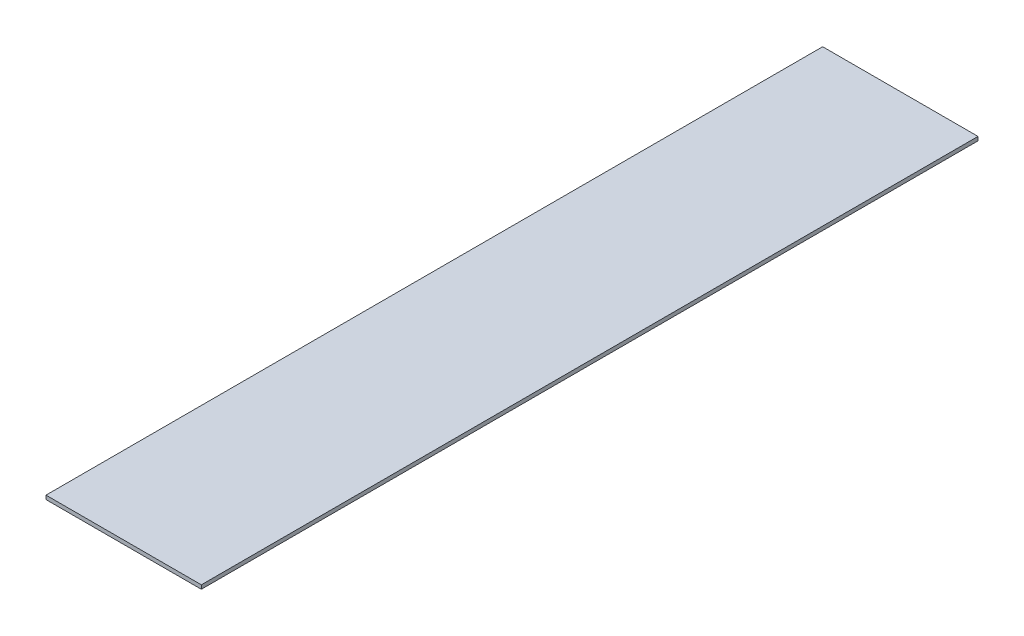
ISO-10303-21;
HEADER;
FILE_DESCRIPTION(('STEP AP214'),'2;1');
FILE_NAME('part.step','',(''),(''),'','','');
FILE_SCHEMA(('AUTOMOTIVE_DESIGN { 1 0 10303 214 1 1 1 1 }'));
ENDSEC;
DATA;
#1=APPLICATION_CONTEXT('core data for automotive mechanical design processes');
#2=APPLICATION_PROTOCOL_DEFINITION('international standard','automotive_design',2000,#1);
#3=PRODUCT_CONTEXT('',#1,'mechanical');
#4=PRODUCT('Part','Part','',(#3));
#5=PRODUCT_RELATED_PRODUCT_CATEGORY('part','',(#4));
#6=PRODUCT_DEFINITION_FORMATION('','',#4);
#7=PRODUCT_DEFINITION_CONTEXT('part definition',#1,'design');
#8=PRODUCT_DEFINITION('design','',#6,#7);
#9=PRODUCT_DEFINITION_SHAPE('','',#8);
#10=(LENGTH_UNIT() NAMED_UNIT(*) SI_UNIT(.MILLI.,.METRE.));
#11=(NAMED_UNIT(*) PLANE_ANGLE_UNIT() SI_UNIT($,.RADIAN.));
#12=(NAMED_UNIT(*) SI_UNIT($,.STERADIAN.) SOLID_ANGLE_UNIT());
#13=UNCERTAINTY_MEASURE_WITH_UNIT(LENGTH_MEASURE(1.E-05),#10,'distance_accuracy_value','');
#14=(GEOMETRIC_REPRESENTATION_CONTEXT(3) GLOBAL_UNCERTAINTY_ASSIGNED_CONTEXT((#13)) GLOBAL_UNIT_ASSIGNED_CONTEXT((#10,
#11,#12)) REPRESENTATION_CONTEXT('',''));
#15=CARTESIAN_POINT('',(0.,0.,0.));
#16=DIRECTION('',(0.,0.,1.));
#17=DIRECTION('',(1.,0.,0.));
#18=AXIS2_PLACEMENT_3D('',#15,#16,#17);
#19=CARTESIAN_POINT('',(60.,3.,-300.));
#20=DIRECTION('',(-1.,0.,0.));
#21=DIRECTION('',(0.,0.,1.));
#22=AXIS2_PLACEMENT_3D('',#19,#20,#21);
#23=PLANE('',#22);
#24=DIRECTION('',(0.,0.,-1.));
#25=VECTOR('',#24,1.);
#26=CARTESIAN_POINT('',(60.,0.,-300.));
#27=LINE('',#26,#25);
#28=CARTESIAN_POINT('',(60.,0.,300.));
#29=VERTEX_POINT('',#28);
#30=CARTESIAN_POINT('',(60.,0.,-300.));
#31=VERTEX_POINT('',#30);
#32=EDGE_CURVE('E98',#29,#31,#27,.T.);
#33=ORIENTED_EDGE('',*,*,#32,.T.);
#34=DIRECTION('',(0.,-1.,0.));
#35=VECTOR('',#34,1.);
#36=CARTESIAN_POINT('',(60.,3.,-300.));
#37=LINE('',#36,#35);
#38=CARTESIAN_POINT('',(60.,3.,-300.));
#39=VERTEX_POINT('',#38);
#40=EDGE_CURVE('E11',#39,#31,#37,.T.);
#41=ORIENTED_EDGE('',*,*,#40,.F.);
#42=DIRECTION('',(0.,0.,-1.));
#43=VECTOR('',#42,1.);
#44=CARTESIAN_POINT('',(60.,3.,-300.));
#45=LINE('',#44,#43);
#46=CARTESIAN_POINT('',(60.,3.,300.));
#47=VERTEX_POINT('',#46);
#48=EDGE_CURVE('E86',#47,#39,#45,.T.);
#49=ORIENTED_EDGE('',*,*,#48,.F.);
#50=DIRECTION('',(0.,-1.,0.));
#51=VECTOR('',#50,1.);
#52=CARTESIAN_POINT('',(60.,3.,300.));
#53=LINE('',#52,#51);
#54=EDGE_CURVE('E94',#47,#29,#53,.T.);
#55=ORIENTED_EDGE('',*,*,#54,.T.);
#56=EDGE_LOOP('',(#33,#41,#49,#55));
#57=FACE_BOUND('',#56,.T.);
#58=ADVANCED_FACE('F35',(#57),#23,.F.);
#59=CARTESIAN_POINT('',(-60.,3.,-300.));
#60=DIRECTION('',(0.,0.,1.));
#61=DIRECTION('',(1.,0.,0.));
#62=AXIS2_PLACEMENT_3D('',#59,#60,#61);
#63=PLANE('',#62);
#64=DIRECTION('',(-1.,0.,0.));
#65=VECTOR('',#64,1.);
#66=CARTESIAN_POINT('',(-60.,0.,-300.));
#67=LINE('',#66,#65);
#68=CARTESIAN_POINT('',(-60.,0.,-300.));
#69=VERTEX_POINT('',#68);
#70=EDGE_CURVE('E90',#31,#69,#67,.T.);
#71=ORIENTED_EDGE('',*,*,#70,.T.);
#72=DIRECTION('',(0.,-1.,0.));
#73=VECTOR('',#72,1.);
#74=CARTESIAN_POINT('',(-60.,3.,-300.));
#75=LINE('',#74,#73);
#76=CARTESIAN_POINT('',(-60.,3.,-300.));
#77=VERTEX_POINT('',#76);
#78=EDGE_CURVE('E43',#77,#69,#75,.T.);
#79=ORIENTED_EDGE('',*,*,#78,.F.);
#80=DIRECTION('',(-1.,0.,0.));
#81=VECTOR('',#80,1.);
#82=CARTESIAN_POINT('',(-60.,3.,-300.));
#83=LINE('',#82,#81);
#84=EDGE_CURVE('E81',#39,#77,#83,.T.);
#85=ORIENTED_EDGE('',*,*,#84,.F.);
#86=ORIENTED_EDGE('',*,*,#40,.T.);
#87=EDGE_LOOP('',(#71,#79,#85,#86));
#88=FACE_BOUND('',#87,.T.);
#89=ADVANCED_FACE('F89',(#88),#63,.F.);
#90=CARTESIAN_POINT('',(-60.,3.,-300.));
#91=DIRECTION('',(1.,0.,0.));
#92=DIRECTION('',(0.,0.,-1.));
#93=AXIS2_PLACEMENT_3D('',#90,#91,#92);
#94=PLANE('',#93);
#95=DIRECTION('',(0.,0.,1.));
#96=VECTOR('',#95,1.);
#97=CARTESIAN_POINT('',(-60.,0.,-300.));
#98=LINE('',#97,#96);
#99=CARTESIAN_POINT('',(-59.9999999999999,0.,300.));
#100=VERTEX_POINT('',#99);
#101=EDGE_CURVE('E68',#69,#100,#98,.T.);
#102=ORIENTED_EDGE('',*,*,#101,.T.);
#103=DIRECTION('',(0.,-1.,0.));
#104=VECTOR('',#103,1.);
#105=CARTESIAN_POINT('',(-59.9999999999999,3.,300.));
#106=LINE('',#105,#104);
#107=CARTESIAN_POINT('',(-59.9999999999999,3.,300.));
#108=VERTEX_POINT('',#107);
#109=EDGE_CURVE('E91',#108,#100,#106,.T.);
#110=ORIENTED_EDGE('',*,*,#109,.F.);
#111=DIRECTION('',(0.,0.,1.));
#112=VECTOR('',#111,1.);
#113=CARTESIAN_POINT('',(-60.,3.,-300.));
#114=LINE('',#113,#112);
#115=EDGE_CURVE('E84',#77,#108,#114,.T.);
#116=ORIENTED_EDGE('',*,*,#115,.F.);
#117=ORIENTED_EDGE('',*,*,#78,.T.);
#118=EDGE_LOOP('',(#102,#110,#116,#117));
#119=FACE_BOUND('',#118,.T.);
#120=ADVANCED_FACE('F92',(#119),#94,.F.);
#121=CARTESIAN_POINT('',(-59.9999999999999,3.,300.));
#122=DIRECTION('',(0.,0.,-1.));
#123=DIRECTION('',(-1.,0.,0.));
#124=AXIS2_PLACEMENT_3D('',#121,#122,#123);
#125=PLANE('',#124);
#126=DIRECTION('',(1.,0.,0.));
#127=VECTOR('',#126,1.);
#128=CARTESIAN_POINT('',(-59.9999999999999,0.,300.));
#129=LINE('',#128,#127);
#130=EDGE_CURVE('E74',#100,#29,#129,.T.);
#131=ORIENTED_EDGE('',*,*,#130,.T.);
#132=ORIENTED_EDGE('',*,*,#54,.F.);
#133=DIRECTION('',(1.,0.,0.));
#134=VECTOR('',#133,1.);
#135=CARTESIAN_POINT('',(-59.9999999999999,3.,300.));
#136=LINE('',#135,#134);
#137=EDGE_CURVE('E51',#108,#47,#136,.T.);
#138=ORIENTED_EDGE('',*,*,#137,.F.);
#139=ORIENTED_EDGE('',*,*,#109,.T.);
#140=EDGE_LOOP('',(#131,#132,#138,#139));
#141=FACE_BOUND('',#140,.T.);
#142=ADVANCED_FACE('F105',(#141),#125,.F.);
#143=CARTESIAN_POINT('',(0.,3.,0.));
#144=DIRECTION('',(0.,1.,0.));
#145=DIRECTION('',(0.,0.,1.));
#146=AXIS2_PLACEMENT_3D('',#143,#144,#145);
#147=PLANE('',#146);
#148=ORIENTED_EDGE('',*,*,#48,.T.);
#149=ORIENTED_EDGE('',*,*,#84,.T.);
#150=ORIENTED_EDGE('',*,*,#115,.T.);
#151=ORIENTED_EDGE('',*,*,#137,.T.);
#152=EDGE_LOOP('',(#148,#149,#150,#151));
#153=FACE_BOUND('',#152,.T.);
#154=ADVANCED_FACE('F82',(#153),#147,.T.);
#155=CARTESIAN_POINT('',(0.,0.,0.));
#156=DIRECTION('',(0.,1.,0.));
#157=DIRECTION('',(0.,0.,1.));
#158=AXIS2_PLACEMENT_3D('',#155,#156,#157);
#159=PLANE('',#158);
#160=ORIENTED_EDGE('',*,*,#32,.F.);
#161=ORIENTED_EDGE('',*,*,#130,.F.);
#162=ORIENTED_EDGE('',*,*,#101,.F.);
#163=ORIENTED_EDGE('',*,*,#70,.F.);
#164=EDGE_LOOP('',(#160,#161,#162,#163));
#165=FACE_BOUND('',#164,.T.);
#166=ADVANCED_FACE('F108',(#165),#159,.F.);
#167=CLOSED_SHELL('',(#58,#89,#120,#142,#154,#166));
#168=MANIFOLD_SOLID_BREP('B2',#167);
#169=ADVANCED_BREP_SHAPE_REPRESENTATION('',(#18,#168),#14);
#170=SHAPE_DEFINITION_REPRESENTATION(#9,#169);
ENDSEC;
END-ISO-10303-21;
